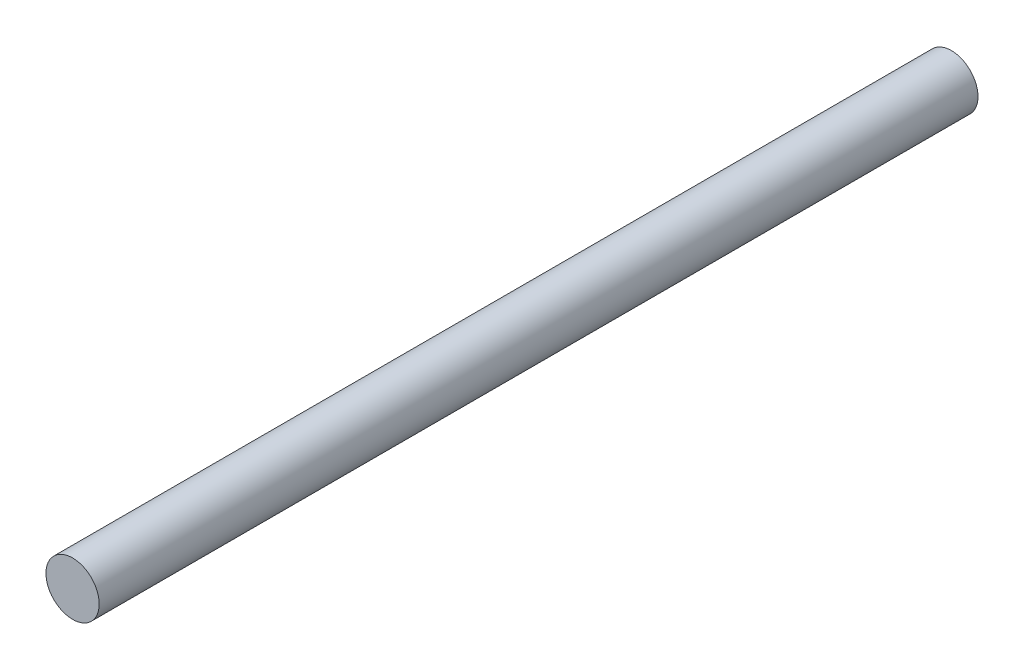
ISO-10303-21;
HEADER;
FILE_DESCRIPTION(('STEP AP214'),'2;1');
FILE_NAME('part.step','',(''),(''),'','','');
FILE_SCHEMA(('AUTOMOTIVE_DESIGN { 1 0 10303 214 1 1 1 1 }'));
ENDSEC;
DATA;
#1=APPLICATION_CONTEXT('core data for automotive mechanical design processes');
#2=APPLICATION_PROTOCOL_DEFINITION('international standard','automotive_design',2000,#1);
#3=PRODUCT_CONTEXT('',#1,'mechanical');
#4=PRODUCT('Part','Part','',(#3));
#5=PRODUCT_RELATED_PRODUCT_CATEGORY('part','',(#4));
#6=PRODUCT_DEFINITION_FORMATION('','',#4);
#7=PRODUCT_DEFINITION_CONTEXT('part definition',#1,'design');
#8=PRODUCT_DEFINITION('design','',#6,#7);
#9=PRODUCT_DEFINITION_SHAPE('','',#8);
#10=(LENGTH_UNIT() NAMED_UNIT(*) SI_UNIT(.MILLI.,.METRE.));
#11=(NAMED_UNIT(*) PLANE_ANGLE_UNIT() SI_UNIT($,.RADIAN.));
#12=(NAMED_UNIT(*) SI_UNIT($,.STERADIAN.) SOLID_ANGLE_UNIT());
#13=UNCERTAINTY_MEASURE_WITH_UNIT(LENGTH_MEASURE(1.E-05),#10,'distance_accuracy_value','');
#14=(GEOMETRIC_REPRESENTATION_CONTEXT(3) GLOBAL_UNCERTAINTY_ASSIGNED_CONTEXT((#13)) GLOBAL_UNIT_ASSIGNED_CONTEXT((#10,
#11,#12)) REPRESENTATION_CONTEXT('',''));
#15=CARTESIAN_POINT('',(0.,0.,0.));
#16=DIRECTION('',(0.,0.,1.));
#17=DIRECTION('',(1.,0.,0.));
#18=AXIS2_PLACEMENT_3D('',#15,#16,#17);
#19=CARTESIAN_POINT('',(0.,0.,33.));
#20=DIRECTION('',(0.,0.,-1.));
#21=DIRECTION('',(-1.,0.,0.));
#22=AXIS2_PLACEMENT_3D('',#19,#20,#21);
#23=CYLINDRICAL_SURFACE('',#22,1.);
#24=CARTESIAN_POINT('',(0.,0.,33.));
#25=DIRECTION('',(0.,0.,1.));
#26=DIRECTION('',(1.,0.,0.));
#27=AXIS2_PLACEMENT_3D('',#24,#25,#26);
#28=CIRCLE('',#27,1.);
#29=CARTESIAN_POINT('',(1.,0.,33.));
#30=VERTEX_POINT('',#29);
#31=EDGE_CURVE('E10',#30,#30,#28,.T.);
#32=ORIENTED_EDGE('',*,*,#31,.F.);
#33=EDGE_LOOP('',(#32));
#34=FACE_BOUND('',#33,.T.);
#35=CARTESIAN_POINT('',(0.,0.,0.));
#36=DIRECTION('',(0.,0.,1.));
#37=DIRECTION('',(1.,0.,0.));
#38=AXIS2_PLACEMENT_3D('',#35,#36,#37);
#39=CIRCLE('',#38,1.);
#40=CARTESIAN_POINT('',(1.,0.,0.));
#41=VERTEX_POINT('',#40);
#42=EDGE_CURVE('E40',#41,#41,#39,.T.);
#43=ORIENTED_EDGE('',*,*,#42,.T.);
#44=EDGE_LOOP('',(#43));
#45=FACE_BOUND('',#44,.T.);
#46=ADVANCED_FACE('F37',(#34,#45),#23,.T.);
#47=CARTESIAN_POINT('',(0.,0.,33.));
#48=DIRECTION('',(0.,0.,1.));
#49=DIRECTION('',(1.,0.,0.));
#50=AXIS2_PLACEMENT_3D('',#47,#48,#49);
#51=PLANE('',#50);
#52=ORIENTED_EDGE('',*,*,#31,.T.);
#53=EDGE_LOOP('',(#52));
#54=FACE_BOUND('',#53,.T.);
#55=ADVANCED_FACE('F54',(#54),#51,.T.);
#56=CARTESIAN_POINT('',(0.,0.,0.));
#57=DIRECTION('',(0.,0.,1.));
#58=DIRECTION('',(1.,0.,0.));
#59=AXIS2_PLACEMENT_3D('',#56,#57,#58);
#60=PLANE('',#59);
#61=ORIENTED_EDGE('',*,*,#42,.F.);
#62=EDGE_LOOP('',(#61));
#63=FACE_BOUND('',#62,.T.);
#64=ADVANCED_FACE('F52',(#63),#60,.F.);
#65=CLOSED_SHELL('',(#46,#55,#64));
#66=MANIFOLD_SOLID_BREP('B2',#65);
#67=ADVANCED_BREP_SHAPE_REPRESENTATION('',(#18,#66),#14);
#68=SHAPE_DEFINITION_REPRESENTATION(#9,#67);
ENDSEC;
END-ISO-10303-21;
